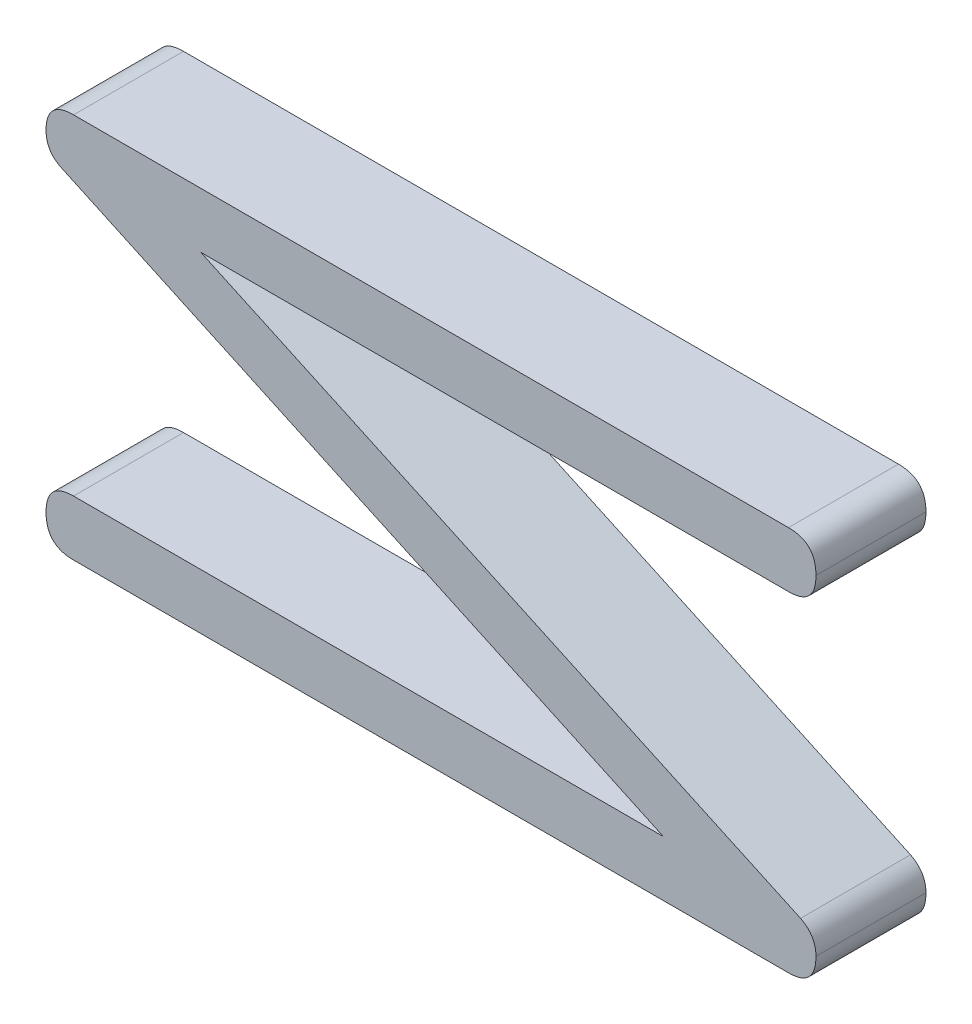
ISO-10303-21;
HEADER;
FILE_DESCRIPTION(('STEP AP214'),'2;1');
FILE_NAME('part.step','',(''),(''),'','','');
FILE_SCHEMA(('AUTOMOTIVE_DESIGN { 1 0 10303 214 1 1 1 1 }'));
ENDSEC;
DATA;
#1=APPLICATION_CONTEXT('core data for automotive mechanical design processes');
#2=APPLICATION_PROTOCOL_DEFINITION('international standard','automotive_design',2000,#1);
#3=PRODUCT_CONTEXT('',#1,'mechanical');
#4=PRODUCT('Part','Part','',(#3));
#5=PRODUCT_RELATED_PRODUCT_CATEGORY('part','',(#4));
#6=PRODUCT_DEFINITION_FORMATION('','',#4);
#7=PRODUCT_DEFINITION_CONTEXT('part definition',#1,'design');
#8=PRODUCT_DEFINITION('design','',#6,#7);
#9=PRODUCT_DEFINITION_SHAPE('','',#8);
#10=(LENGTH_UNIT() NAMED_UNIT(*) SI_UNIT(.MILLI.,.METRE.));
#11=(NAMED_UNIT(*) PLANE_ANGLE_UNIT() SI_UNIT($,.RADIAN.));
#12=(NAMED_UNIT(*) SI_UNIT($,.STERADIAN.) SOLID_ANGLE_UNIT());
#13=UNCERTAINTY_MEASURE_WITH_UNIT(LENGTH_MEASURE(1.E-05),#10,'distance_accuracy_value','');
#14=(GEOMETRIC_REPRESENTATION_CONTEXT(3) GLOBAL_UNCERTAINTY_ASSIGNED_CONTEXT((#13)) GLOBAL_UNIT_ASSIGNED_CONTEXT((#10,
#11,#12)) REPRESENTATION_CONTEXT('',''));
#15=CARTESIAN_POINT('',(0.,0.,0.));
#16=DIRECTION('',(0.,0.,1.));
#17=DIRECTION('',(1.,0.,0.));
#18=AXIS2_PLACEMENT_3D('',#15,#16,#17);
#19=CARTESIAN_POINT('',(0.,0.,-0.1));
#20=DIRECTION('',(0.,0.,1.));
#21=DIRECTION('',(1.,0.,0.));
#22=AXIS2_PLACEMENT_3D('',#19,#20,#21);
#23=PLANE('',#22);
#24=CARTESIAN_POINT('',(3.5250075,-20.49008,-0.1));
#25=CARTESIAN_POINT('',(3.52296452008364,-20.4900718505937,-0.1));
#26=CARTESIAN_POINT('',(3.5208903994327,-20.4899513868778,-0.1));
#27=CARTESIAN_POINT('',(3.51676154690741,-20.4893258347474,-0.1));
#28=CARTESIAN_POINT('',(3.51470814572294,-20.488812690891,-0.1));
#29=CARTESIAN_POINT('',(3.51078661994044,-20.4872236873782,-0.1));
#30=CARTESIAN_POINT('',(3.50891977957045,-20.4861442096614,-0.1));
#31=CARTESIAN_POINT('',(3.5056904265819,-20.4833732947515,-0.1));
#32=CARTESIAN_POINT('',(3.50432981317407,-20.4816795991802,-0.1));
#33=CARTESIAN_POINT('',(3.50199005832095,-20.4775521301757,-0.1));
#34=CARTESIAN_POINT('',(3.50116837346649,-20.4750376561436,-0.1));
#35=CARTESIAN_POINT('',(3.5001853549542,-20.4699423877113,-0.1));
#36=CARTESIAN_POINT('',(3.50000631658705,-20.4673653742619,-0.1));
#37=CARTESIAN_POINT('',(3.5,-20.46488,-0.1));
#38=B_SPLINE_CURVE_WITH_KNOTS('',3,(#24,#25,#26,#27,#28,#29,#30,#31,#32,#33,#34,#35,#36,#37),
.UNSPECIFIED.,.F.,.F.,(4,2,2,2,2,2,4),(0.,0.00617555295361522,0.0124813041899314,
0.018827839685844,0.0251979509500649,0.0330188630002425,0.0406225830086277),.UNSPECIFIED.);
#39=CARTESIAN_POINT('',(3.5250075,-20.49008,-0.1));
#40=VERTEX_POINT('',#39);
#41=CARTESIAN_POINT('',(3.5,-20.46488,-0.1));
#42=VERTEX_POINT('',#41);
#43=EDGE_CURVE('E267',#40,#42,#38,.T.);
#44=ORIENTED_EDGE('',*,*,#43,.T.);
#45=CARTESIAN_POINT('',(3.5,-20.46488,-0.1));
#46=CARTESIAN_POINT('',(3.50000893182355,-20.4627859598788,-0.1));
#47=CARTESIAN_POINT('',(3.5001321019316,-20.4606579623583,-0.1));
#48=CARTESIAN_POINT('',(3.50077736122484,-20.4564211796358,-0.1));
#49=CARTESIAN_POINT('',(3.50130815567586,-20.4543138438055,-0.1));
#50=CARTESIAN_POINT('',(3.50293808048682,-20.4503469956254,-0.1));
#51=CARTESIAN_POINT('',(3.50402636884528,-20.4484835777051,-0.1));
#52=CARTESIAN_POINT('',(3.50681364295623,-20.4452638408361,-0.1));
#53=CARTESIAN_POINT('',(3.50851494360153,-20.443909484388,-0.1));
#54=CARTESIAN_POINT('',(3.51264792830977,-20.4415948064364,-0.1));
#55=CARTESIAN_POINT('',(3.51515790533313,-20.4407889153056,-0.1));
#56=CARTESIAN_POINT('',(3.5201414548077,-20.4398544716161,-0.1));
#57=CARTESIAN_POINT('',(3.52260669071904,-20.439685103672,-0.1));
#58=CARTESIAN_POINT('',(3.52499,-20.43968,-0.1));
#59=B_SPLINE_CURVE_WITH_KNOTS('',3,(#45,#46,#47,#48,#49,#50,#51,#52,#53,#54,#55,#56,#57,#58),
.UNSPECIFIED.,.F.,.F.,(4,2,2,2,2,2,4),(0.,0.00633350416974893,0.0128061629194577,
0.0191574692673836,0.0255330155642557,0.0333252555174583,0.0406083684014851),.UNSPECIFIED.);
#60=CARTESIAN_POINT('',(3.52499,-20.43968,-0.1));
#61=VERTEX_POINT('',#60);
#62=EDGE_CURVE('E145',#42,#61,#59,.T.);
#63=ORIENTED_EDGE('',*,*,#62,.T.);
#64=DIRECTION('',(1.,0.,0.));
#65=VECTOR('',#64,1.);
#66=CARTESIAN_POINT('',(4.0614175,-20.43968,-0.1));
#67=LINE('',#66,#65);
#68=CARTESIAN_POINT('',(4.0614175,-20.43968,-0.1));
#69=VERTEX_POINT('',#68);
#70=EDGE_CURVE('E142',#69,#61,#67,.F.);
#71=ORIENTED_EDGE('',*,*,#70,.F.);
#72=DIRECTION('',(0.907820757142357,-0.419358406260656,0.));
#73=VECTOR('',#72,1.);
#74=CARTESIAN_POINT('',(3.51449,-20.1870325,-0.1));
#75=LINE('',#74,#73);
#76=CARTESIAN_POINT('',(3.51449,-20.1870325,-0.1));
#77=VERTEX_POINT('',#76);
#78=EDGE_CURVE('E149',#77,#69,#75,.T.);
#79=ORIENTED_EDGE('',*,*,#78,.F.);
#80=CARTESIAN_POINT('',(3.51449,-20.1870325,-0.1));
#81=CARTESIAN_POINT('',(3.51317660788709,-20.1864415152522,-0.1));
#82=CARTESIAN_POINT('',(3.51189568398104,-20.1857640365538,-0.1));
#83=CARTESIAN_POINT('',(3.50945267479109,-20.184209445395,-0.1));
#84=CARTESIAN_POINT('',(3.50829131387652,-20.1833312093119,-0.1));
#85=CARTESIAN_POINT('',(3.50546021943163,-20.1807084619182,-0.1));
#86=CARTESIAN_POINT('',(3.5039546931724,-20.1787730283499,-0.1));
#87=CARTESIAN_POINT('',(3.50170045192129,-20.1745267557376,-0.1));
#88=CARTESIAN_POINT('',(3.50095056821364,-20.1722165028545,-0.1));
#89=CARTESIAN_POINT('',(3.50014729378707,-20.1679203441977,-0.1));
#90=CARTESIAN_POINT('',(3.49999047038929,-20.1659538154576,-0.1));
#91=CARTESIAN_POINT('',(3.5,-20.16402,-0.1));
#92=B_SPLINE_CURVE_WITH_KNOTS('',3,(#80,#81,#82,#83,#84,#85,#86,#87,#88,#89,#90,#91),
.UNSPECIFIED.,.F.,.F.,(4,2,2,2,2,4),(0.,0.00432548880511277,0.00867580696156998,
0.0158710193284312,0.0230550860485164,0.0289058742713423),.UNSPECIFIED.);
#93=CARTESIAN_POINT('',(3.5,-20.16402,-0.1));
#94=VERTEX_POINT('',#93);
#95=EDGE_CURVE('E278',#77,#94,#92,.T.);
#96=ORIENTED_EDGE('',*,*,#95,.T.);
#97=CARTESIAN_POINT('',(3.5,-20.16402,-0.1));
#98=CARTESIAN_POINT('',(3.5000074677176,-20.1620457355184,-0.1));
#99=CARTESIAN_POINT('',(3.50012407901857,-20.1600428306186,-0.1));
#100=CARTESIAN_POINT('',(3.50072554080283,-20.1560562124187,-0.1));
#101=CARTESIAN_POINT('',(3.50121785646545,-20.1540737246085,-0.1));
#102=CARTESIAN_POINT('',(3.50275278149649,-20.1502439483329,-0.1));
#103=CARTESIAN_POINT('',(3.50380981073264,-20.1484017189147,-0.1));
#104=CARTESIAN_POINT('',(3.50652783424327,-20.1452121400093,-0.1));
#105=CARTESIAN_POINT('',(3.50819100701368,-20.1438666112378,-0.1));
#106=CARTESIAN_POINT('',(3.51225449404836,-20.1415412970796,-0.1));
#107=CARTESIAN_POINT('',(3.51473629318445,-20.1407191613942,-0.1));
#108=CARTESIAN_POINT('',(3.51984718867093,-20.1397113730119,-0.1));
#109=CARTESIAN_POINT('',(3.52247663930076,-20.1395273240125,-0.1));
#110=CARTESIAN_POINT('',(3.5250075,-20.13952,-0.1));
#111=B_SPLINE_CURVE_WITH_KNOTS('',3,(#97,#98,#99,#100,#101,#102,#103,#104,#105,#106,#107,#108,
#109,#110),.UNSPECIFIED.,.F.,.F.,(4,2,2,2,2,2,4),(0.,0.00596527696958312,0.0120522723231094,
0.0183026965668949,0.0245758101777502,0.0323066640740081,0.0400569338244089),.UNSPECIFIED.);
#112=CARTESIAN_POINT('',(3.5250075,-20.13952,-0.1));
#113=VERTEX_POINT('',#112);
#114=EDGE_CURVE('E158',#94,#113,#111,.T.);
#115=ORIENTED_EDGE('',*,*,#114,.T.);
#116=DIRECTION('',(1.,0.,0.));
#117=VECTOR('',#116,1.);
#118=CARTESIAN_POINT('',(4.1749925,-20.13952,-0.1));
#119=LINE('',#118,#117);
#120=CARTESIAN_POINT('',(4.1749925,-20.13952,-0.1));
#121=VERTEX_POINT('',#120);
#122=EDGE_CURVE('E155',#121,#113,#119,.F.);
#123=ORIENTED_EDGE('',*,*,#122,.F.);
#124=CARTESIAN_POINT('',(4.1749925,-20.13952,-0.1));
#125=CARTESIAN_POINT('',(4.17703547991636,-20.1395281494064,-0.1));
#126=CARTESIAN_POINT('',(4.1791096005673,-20.1396486131222,-0.1));
#127=CARTESIAN_POINT('',(4.1832384530926,-20.1402741652526,-0.1));
#128=CARTESIAN_POINT('',(4.18529185427707,-20.140787309109,-0.1));
#129=CARTESIAN_POINT('',(4.18921338005957,-20.1423763126218,-0.1));
#130=CARTESIAN_POINT('',(4.19108022042955,-20.1434557903386,-0.1));
#131=CARTESIAN_POINT('',(4.1943095734181,-20.1462267052485,-0.1));
#132=CARTESIAN_POINT('',(4.19567018682593,-20.1479204008198,-0.1));
#133=CARTESIAN_POINT('',(4.19800994167905,-20.1520478698243,-0.1));
#134=CARTESIAN_POINT('',(4.19883162653351,-20.1545623438564,-0.1));
#135=CARTESIAN_POINT('',(4.1998146450458,-20.1596576122887,-0.1));
#136=CARTESIAN_POINT('',(4.19999368341295,-20.1622346257381,-0.1));
#137=CARTESIAN_POINT('',(4.2,-20.16472,-0.1));
#138=B_SPLINE_CURVE_WITH_KNOTS('',3,(#124,#125,#126,#127,#128,#129,#130,#131,#132,#133,#134,
#135,#136,#137),.UNSPECIFIED.,.F.,.F.,(4,2,2,2,2,2,4),(0.,0.00617555295361936,
0.0124813041899398,0.0188278396858512,0.0251979509500656,0.0330188630002394,0.0406225830086281),.UNSPECIFIED.);
#139=CARTESIAN_POINT('',(4.2,-20.16472,-0.1));
#140=VERTEX_POINT('',#139);
#141=EDGE_CURVE('E287',#121,#140,#138,.T.);
#142=ORIENTED_EDGE('',*,*,#141,.T.);
#143=CARTESIAN_POINT('',(4.2,-20.16472,-0.1));
#144=CARTESIAN_POINT('',(4.1999909019491,-20.1668218121608,-0.1));
#145=CARTESIAN_POINT('',(4.19986734772854,-20.1689581728151,-0.1));
#146=CARTESIAN_POINT('',(4.19921879497746,-20.1732117648662,-0.1));
#147=CARTESIAN_POINT('',(4.19868495643573,-20.1753275219203,-0.1));
#148=CARTESIAN_POINT('',(4.19704865942118,-20.1792976064122,-0.1));
#149=CARTESIAN_POINT('',(4.19596028947454,-20.1811570254627,-0.1));
#150=CARTESIAN_POINT('',(4.19317420021518,-20.1843690212312,-0.1));
#151=CARTESIAN_POINT('',(4.19147415814831,-20.1857196252091,-0.1));
#152=CARTESIAN_POINT('',(4.18734703459122,-20.1880247878816,-0.1));
#153=CARTESIAN_POINT('',(4.18484230990065,-20.1888258249257,-0.1));
#154=CARTESIAN_POINT('',(4.17989147928511,-20.1897481820867,-0.1));
#155=CARTESIAN_POINT('',(4.17745460220649,-20.1899151452056,-0.1));
#156=CARTESIAN_POINT('',(4.1750975,-20.18992,-0.1));
#157=B_SPLINE_CURVE_WITH_KNOTS('',3,(#143,#144,#145,#146,#147,#148,#149,#150,#151,#152,#153,
#154,#155,#156),.UNSPECIFIED.,.F.,.F.,(4,2,2,2,2,2,4),(0.,0.00635783536498901,
0.0128566354820755,0.0191979975215553,0.0255636987977634,0.0333364174536253,0.0405376862319979),.UNSPECIFIED.);
#158=CARTESIAN_POINT('',(4.1750975,-20.18992,-0.1));
#159=VERTEX_POINT('',#158);
#160=EDGE_CURVE('E163',#140,#159,#157,.T.);
#161=ORIENTED_EDGE('',*,*,#160,.T.);
#162=DIRECTION('',(1.,0.,0.));
#163=VECTOR('',#162,1.);
#164=CARTESIAN_POINT('',(3.640665,-20.18992,-0.1));
#165=LINE('',#164,#163);
#166=CARTESIAN_POINT('',(3.640665,-20.18992,-0.1));
#167=VERTEX_POINT('',#166);
#168=EDGE_CURVE('E160',#167,#159,#165,.T.);
#169=ORIENTED_EDGE('',*,*,#168,.F.);
#170=DIRECTION('',(-0.907921004621454,0.419141323860067,0.));
#171=VECTOR('',#170,1.);
#172=CARTESIAN_POINT('',(4.185965,-20.4416575,-0.1));
#173=LINE('',#172,#171);
#174=CARTESIAN_POINT('',(4.185965,-20.4416575,-0.1));
#175=VERTEX_POINT('',#174);
#176=EDGE_CURVE('E167',#175,#167,#173,.T.);
#177=ORIENTED_EDGE('',*,*,#176,.F.);
#178=CARTESIAN_POINT('',(4.185965,-20.4416575,-0.1));
#179=CARTESIAN_POINT('',(4.18731203727069,-20.4423436849057,-0.1));
#180=CARTESIAN_POINT('',(4.18862081974825,-20.4431190392838,-0.1));
#181=CARTESIAN_POINT('',(4.1911032119283,-20.4448730263518,-0.1));
#182=CARTESIAN_POINT('',(4.19227603664418,-20.4458527561509,-0.1));
#183=CARTESIAN_POINT('',(4.19510370066546,-20.4487400800642,-0.1));
#184=CARTESIAN_POINT('',(4.19657816534535,-20.4508374566413,-0.1));
#185=CARTESIAN_POINT('',(4.19871785639162,-20.4553898753281,-0.1));
#186=CARTESIAN_POINT('',(4.19938428920636,-20.4578443780706,-0.1));
#187=CARTESIAN_POINT('',(4.19991690207689,-20.461754445559,-0.1));
#188=CARTESIAN_POINT('',(4.20000430958463,-20.4631840276869,-0.1));
#189=CARTESIAN_POINT('',(4.2,-20.4646,-0.1));
#190=B_SPLINE_CURVE_WITH_KNOTS('',3,(#178,#179,#180,#181,#182,#183,#184,#185,#186,#187,#188,
#189),.UNSPECIFIED.,.F.,.F.,(4,2,2,2,2,4),(0.,0.00454066265165424,0.0091063580087707,
0.0166317070213285,0.0241458062678159,0.0284174711604073),.UNSPECIFIED.);
#191=CARTESIAN_POINT('',(4.2,-20.4646,-0.1));
#192=VERTEX_POINT('',#191);
#193=EDGE_CURVE('E116',#175,#192,#190,.T.);
#194=ORIENTED_EDGE('',*,*,#193,.T.);
#195=CARTESIAN_POINT('',(4.2,-20.4646,-0.1));
#196=CARTESIAN_POINT('',(4.19999046333426,-20.4667405394319,-0.1));
#197=CARTESIAN_POINT('',(4.19986478440135,-20.4689172070653,-0.1));
#198=CARTESIAN_POINT('',(4.19920249182751,-20.4732513775683,-0.1));
#199=CARTESIAN_POINT('',(4.19865666740737,-20.4754073390828,-0.1));
#200=CARTESIAN_POINT('',(4.19698951613697,-20.4794278413444,-0.1));
#201=CARTESIAN_POINT('',(4.1958889207296,-20.4812999224628,-0.1));
#202=CARTESIAN_POINT('',(4.19307431168142,-20.484532130242,-0.1));
#203=CARTESIAN_POINT('',(4.19135793471003,-20.4858902424786,-0.1));
#204=CARTESIAN_POINT('',(4.18719663354415,-20.4882021559139,-0.1));
#205=CARTESIAN_POINT('',(4.18467447150821,-20.4890025020549,-0.1));
#206=CARTESIAN_POINT('',(4.17973286315946,-20.4899114662173,-0.1));
#207=CARTESIAN_POINT('',(4.17732440963894,-20.4900755557157,-0.1));
#208=CARTESIAN_POINT('',(4.1749925,-20.49008,-0.1));
#209=B_SPLINE_CURVE_WITH_KNOTS('',3,(#195,#196,#197,#198,#199,#200,#201,#202,#203,#204,#205,
#206,#207,#208),.UNSPECIFIED.,.F.,.F.,(4,2,2,2,2,2,4),(0.,0.0064766563185409,0.0130994908391594,
0.0194913871630938,0.0259080823184698,0.0337285852183506,0.0408495411647651),.UNSPECIFIED.);
#210=CARTESIAN_POINT('',(4.1749925,-20.49008,-0.1));
#211=VERTEX_POINT('',#210);
#212=EDGE_CURVE('E24',#192,#211,#209,.T.);
#213=ORIENTED_EDGE('',*,*,#212,.T.);
#214=DIRECTION('',(1.,0.,0.));
#215=VECTOR('',#214,1.);
#216=CARTESIAN_POINT('',(3.5250075,-20.49008,-0.1));
#217=LINE('',#216,#215);
#218=EDGE_CURVE('E119',#40,#211,#217,.T.);
#219=ORIENTED_EDGE('',*,*,#218,.F.);
#220=EDGE_LOOP('',(#44,#63,#71,#79,#96,#115,#123,#142,#161,#169,#177,#194,#213,#219));
#221=FACE_BOUND('',#220,.T.);
#222=ADVANCED_FACE('F17',(#221),#23,.F.);
#223=CARTESIAN_POINT('',(3.5250075,-20.49008,-0.1));
#224=DIRECTION('',(0.,-1.,0.));
#225=DIRECTION('',(0.,0.,-1.));
#226=AXIS2_PLACEMENT_3D('',#223,#224,#225);
#227=PLANE('',#226);
#228=ORIENTED_EDGE('',*,*,#218,.T.);
#229=DIRECTION('',(0.,0.,1.));
#230=VECTOR('',#229,1.);
#231=CARTESIAN_POINT('',(4.1749925,-20.49008,-0.05));
#232=LINE('',#231,#230);
#233=CARTESIAN_POINT('',(4.1749925,-20.49008,0.));
#234=VERTEX_POINT('',#233);
#235=EDGE_CURVE('E124',#211,#234,#232,.T.);
#236=ORIENTED_EDGE('',*,*,#235,.T.);
#237=DIRECTION('',(1.,0.,0.));
#238=VECTOR('',#237,1.);
#239=CARTESIAN_POINT('',(0.,-20.49008,0.));
#240=LINE('',#239,#238);
#241=CARTESIAN_POINT('',(3.5250075,-20.49008,0.));
#242=VERTEX_POINT('',#241);
#243=EDGE_CURVE('E380',#242,#234,#240,.T.);
#244=ORIENTED_EDGE('',*,*,#243,.F.);
#245=DIRECTION('',(0.,0.,-1.));
#246=VECTOR('',#245,1.);
#247=CARTESIAN_POINT('',(3.5250075,-20.49008,-0.05));
#248=LINE('',#247,#246);
#249=EDGE_CURVE('E130',#242,#40,#248,.T.);
#250=ORIENTED_EDGE('',*,*,#249,.T.);
#251=EDGE_LOOP('',(#228,#236,#244,#250));
#252=FACE_BOUND('',#251,.T.);
#253=ADVANCED_FACE('F126',(#252),#227,.T.);
#254=CARTESIAN_POINT('',(4.1749925,-20.49008,-0.1));
#255=CARTESIAN_POINT('',(4.2,-20.49008,-0.1));
#256=CARTESIAN_POINT('',(4.2,-20.4646,-0.1));
#257=CARTESIAN_POINT('',(4.1749925,-20.49008,0.));
#258=CARTESIAN_POINT('',(4.2,-20.49008,0.));
#259=CARTESIAN_POINT('',(4.2,-20.4646,0.));
#260=B_SPLINE_SURFACE_WITH_KNOTS('',1,2,((#254,#255,#256),(#257,#258,#259)),.UNSPECIFIED.,.F.,
.F.,.F.,(2,2),(3,3),(0.,1.),(0.,1.),.UNSPECIFIED.);
#261=DIRECTION('',(0.,0.,1.));
#262=VECTOR('',#261,1.);
#263=CARTESIAN_POINT('',(4.2,-20.4646,-0.05));
#264=LINE('',#263,#262);
#265=CARTESIAN_POINT('',(4.2,-20.4646,0.));
#266=VERTEX_POINT('',#265);
#267=EDGE_CURVE('E138',#192,#266,#264,.T.);
#268=CARTESIAN_POINT('',(4.1749925,-20.49008,0.));
#269=CARTESIAN_POINT('',(4.17701151499175,-20.4900723065724,0.));
#270=CARTESIAN_POINT('',(4.17906002173778,-20.4899530788115,0.));
#271=CARTESIAN_POINT('',(4.18313747106127,-20.4893375513138,0.));
#272=CARTESIAN_POINT('',(4.18516515198397,-20.4888335727697,0.));
#273=CARTESIAN_POINT('',(4.18907600721271,-20.4872637802937,0.));
#274=CARTESIAN_POINT('',(4.19095454431362,-20.4861847701539,0.));
#275=CARTESIAN_POINT('',(4.19420659474089,-20.4834108898415,0.));
#276=CARTESIAN_POINT('',(4.19557824385566,-20.4817137910214,0.));
#277=CARTESIAN_POINT('',(4.19794706220901,-20.4775689027058,0.));
#278=CARTESIAN_POINT('',(4.19878380176105,-20.4750382876607,0.));
#279=CARTESIAN_POINT('',(4.19980606163213,-20.4698385047735,0.));
#280=CARTESIAN_POINT('',(4.1999926943804,-20.4671695815496,0.));
#281=CARTESIAN_POINT('',(4.2,-20.4646,0.));
#282=B_SPLINE_CURVE_WITH_KNOTS('',3,(#268,#269,#270,#271,#272,#273,#274,#275,#276,#277,#278,
#279,#280,#281),.UNSPECIFIED.,.F.,.F.,(4,2,2,2,2,2,4),(0.,0.00610084746813873,
0.0123267448899605,0.0187020922226042,0.0251006585430123,0.0329819365329532,0.0408497218438369),.UNSPECIFIED.);
#283=EDGE_CURVE('E135',#234,#266,#282,.T.);
#284=ORIENTED_EDGE('',*,*,#235,.F.);
#285=ORIENTED_EDGE('',*,*,#212,.F.);
#286=ORIENTED_EDGE('',*,*,#267,.T.);
#287=ORIENTED_EDGE('',*,*,#283,.F.);
#288=EDGE_LOOP('',(#284,#285,#286,#287));
#289=FACE_BOUND('',#288,.T.);
#290=ADVANCED_FACE('F133',(#289),#260,.F.);
#291=CARTESIAN_POINT('',(4.2,-20.4646,-0.1));
#292=CARTESIAN_POINT('',(4.2,-20.4487975,-0.1));
#293=CARTESIAN_POINT('',(4.185965,-20.4416575,-0.1));
#294=CARTESIAN_POINT('',(4.2,-20.4646,0.));
#295=CARTESIAN_POINT('',(4.2,-20.4487975,0.));
#296=CARTESIAN_POINT('',(4.185965,-20.4416575,0.));
#297=B_SPLINE_SURFACE_WITH_KNOTS('',1,2,((#291,#292,#293),(#294,#295,#296)),.UNSPECIFIED.,.F.,
.F.,.F.,(2,2),(3,3),(0.,1.),(0.,1.),.UNSPECIFIED.);
#298=DIRECTION('',(0.,0.,1.));
#299=VECTOR('',#298,1.);
#300=CARTESIAN_POINT('',(4.185965,-20.4416575,-0.1));
#301=LINE('',#300,#299);
#302=CARTESIAN_POINT('',(4.185965,-20.4416575,0.));
#303=VERTEX_POINT('',#302);
#304=EDGE_CURVE('E170',#303,#175,#301,.F.);
#305=CARTESIAN_POINT('',(4.2,-20.4646,0.));
#306=CARTESIAN_POINT('',(4.1999991069653,-20.4630763957042,0.));
#307=CARTESIAN_POINT('',(4.19990105341469,-20.4615462636576,0.));
#308=CARTESIAN_POINT('',(4.199460395789,-20.4585140988015,0.));
#309=CARTESIAN_POINT('',(4.19911637838131,-20.4570122801095,0.));
#310=CARTESIAN_POINT('',(4.19781962060164,-20.4531698297235,0.));
#311=CARTESIAN_POINT('',(4.19661891772639,-20.4509029946544,0.));
#312=CARTESIAN_POINT('',(4.19352884828714,-20.4469295927163,0.));
#313=CARTESIAN_POINT('',(4.19164041378093,-20.4452222734776,0.));
#314=CARTESIAN_POINT('',(4.18841510175441,-20.4429944305895,0.));
#315=CARTESIAN_POINT('',(4.18720450833347,-20.4422832221327,0.));
#316=CARTESIAN_POINT('',(4.185965,-20.4416575,0.));
#317=B_SPLINE_CURVE_WITH_KNOTS('',3,(#305,#306,#307,#308,#309,#310,#311,#312,#313,#314,#315,
#316),.UNSPECIFIED.,.F.,.F.,(4,2,2,2,2,4),(0.,0.00457654629606753,0.00917960343418862,
0.0167093542780306,0.0242289380696415,0.0284172090697264),.UNSPECIFIED.);
#318=EDGE_CURVE('E220',#266,#303,#317,.T.);
#319=ORIENTED_EDGE('',*,*,#267,.F.);
#320=ORIENTED_EDGE('',*,*,#193,.F.);
#321=ORIENTED_EDGE('',*,*,#304,.F.);
#322=ORIENTED_EDGE('',*,*,#318,.F.);
#323=EDGE_LOOP('',(#319,#320,#321,#322));
#324=FACE_BOUND('',#323,.T.);
#325=ADVANCED_FACE('F231',(#324),#297,.F.);
#326=CARTESIAN_POINT('',(4.185965,-20.4416575,-0.1));
#327=DIRECTION('',(0.419141323860067,0.907921004621454,0.));
#328=DIRECTION('',(-0.907921004621454,0.419141323860067,0.));
#329=AXIS2_PLACEMENT_3D('',#326,#327,#328);
#330=PLANE('',#329);
#331=ORIENTED_EDGE('',*,*,#176,.T.);
#332=DIRECTION('',(0.,0.,-1.));
#333=VECTOR('',#332,1.);
#334=CARTESIAN_POINT('',(3.640665,-20.18992,-0.1));
#335=LINE('',#334,#333);
#336=CARTESIAN_POINT('',(3.640665,-20.18992,0.));
#337=VERTEX_POINT('',#336);
#338=EDGE_CURVE('E164',#337,#167,#335,.T.);
#339=ORIENTED_EDGE('',*,*,#338,.F.);
#340=DIRECTION('',(-0.907921004621454,0.419141323860067,0.));
#341=VECTOR('',#340,1.);
#342=CARTESIAN_POINT('',(4.185965,-20.4416575,0.));
#343=LINE('',#342,#341);
#344=EDGE_CURVE('E226',#303,#337,#343,.T.);
#345=ORIENTED_EDGE('',*,*,#344,.F.);
#346=ORIENTED_EDGE('',*,*,#304,.T.);
#347=EDGE_LOOP('',(#331,#339,#345,#346));
#348=FACE_BOUND('',#347,.T.);
#349=ADVANCED_FACE('F236',(#348),#330,.T.);
#350=CARTESIAN_POINT('',(3.640665,-20.18992,-0.1));
#351=DIRECTION('',(0.,-1.,0.));
#352=DIRECTION('',(0.,0.,-1.));
#353=AXIS2_PLACEMENT_3D('',#350,#351,#352);
#354=PLANE('',#353);
#355=ORIENTED_EDGE('',*,*,#168,.T.);
#356=DIRECTION('',(0.,0.,1.));
#357=VECTOR('',#356,1.);
#358=CARTESIAN_POINT('',(4.1750975,-20.18992,-0.05));
#359=LINE('',#358,#357);
#360=CARTESIAN_POINT('',(4.1750975,-20.18992,0.));
#361=VERTEX_POINT('',#360);
#362=EDGE_CURVE('E292',#159,#361,#359,.T.);
#363=ORIENTED_EDGE('',*,*,#362,.T.);
#364=DIRECTION('',(1.,0.,0.));
#365=VECTOR('',#364,1.);
#366=CARTESIAN_POINT('',(0.,-20.18992,0.));
#367=LINE('',#366,#365);
#368=EDGE_CURVE('E386',#337,#361,#367,.T.);
#369=ORIENTED_EDGE('',*,*,#368,.F.);
#370=ORIENTED_EDGE('',*,*,#338,.T.);
#371=EDGE_LOOP('',(#355,#363,#369,#370));
#372=FACE_BOUND('',#371,.T.);
#373=ADVANCED_FACE('F418',(#372),#354,.T.);
#374=CARTESIAN_POINT('',(4.1750975,-20.18992,-0.1));
#375=CARTESIAN_POINT('',(4.2,-20.18992,-0.1));
#376=CARTESIAN_POINT('',(4.2,-20.16472,-0.1));
#377=CARTESIAN_POINT('',(4.1750975,-20.18992,0.));
#378=CARTESIAN_POINT('',(4.2,-20.18992,0.));
#379=CARTESIAN_POINT('',(4.2,-20.16472,0.));
#380=B_SPLINE_SURFACE_WITH_KNOTS('',1,2,((#374,#375,#376),(#377,#378,#379)),.UNSPECIFIED.,.F.,
.F.,.F.,(2,2),(3,3),(0.,1.),(0.,1.),.UNSPECIFIED.);
#381=DIRECTION('',(0.,0.,1.));
#382=VECTOR('',#381,1.);
#383=CARTESIAN_POINT('',(4.2,-20.16472,-0.05));
#384=LINE('',#383,#382);
#385=CARTESIAN_POINT('',(4.2,-20.16472,0.));
#386=VERTEX_POINT('',#385);
#387=EDGE_CURVE('E291',#140,#386,#384,.T.);
#388=CARTESIAN_POINT('',(4.1750975,-20.18992,0.));
#389=CARTESIAN_POINT('',(4.17712279571802,-20.189912061044,0.));
#390=CARTESIAN_POINT('',(4.17917846568021,-20.1897925700579,0.));
#391=CARTESIAN_POINT('',(4.18327042743507,-20.1891734608418,0.));
#392=CARTESIAN_POINT('',(4.18530542077264,-20.1886659661407,0.));
#393=CARTESIAN_POINT('',(4.18920646570121,-20.1870909569996,0.));
#394=CARTESIAN_POINT('',(4.19106994820774,-20.1860161768611,0.));
#395=CARTESIAN_POINT('',(4.19429443272661,-20.1832557297779,0.));
#396=CARTESIAN_POINT('',(4.1956535566115,-20.1815678249291,0.));
#397=CARTESIAN_POINT('',(4.1979945463625,-20.1774510284904,0.));
#398=CARTESIAN_POINT('',(4.19881849633399,-20.1749409744781,0.));
#399=CARTESIAN_POINT('',(4.19981218436634,-20.1698275960162,0.));
#400=CARTESIAN_POINT('',(4.1999933476224,-20.1672267391435,0.));
#401=CARTESIAN_POINT('',(4.2,-20.16472,0.));
#402=B_SPLINE_CURVE_WITH_KNOTS('',3,(#388,#389,#390,#391,#392,#393,#394,#395,#396,#397,#398,
#399,#400,#401),.UNSPECIFIED.,.F.,.F.,(4,2,2,2,2,2,4),(0.,0.00612121982034474,
0.0123701121634089,0.0187010539466916,0.0250553397488909,0.0328663454030752,0.0405377990669611),.UNSPECIFIED.);
#403=EDGE_CURVE('E214',#361,#386,#402,.T.);
#404=ORIENTED_EDGE('',*,*,#362,.F.);
#405=ORIENTED_EDGE('',*,*,#160,.F.);
#406=ORIENTED_EDGE('',*,*,#387,.T.);
#407=ORIENTED_EDGE('',*,*,#403,.F.);
#408=EDGE_LOOP('',(#404,#405,#406,#407));
#409=FACE_BOUND('',#408,.T.);
#410=ADVANCED_FACE('F241',(#409),#380,.F.);
#411=CARTESIAN_POINT('',(4.2,-20.16472,-0.1));
#412=CARTESIAN_POINT('',(4.2,-20.13952,-0.1));
#413=CARTESIAN_POINT('',(4.1749925,-20.13952,-0.1));
#414=CARTESIAN_POINT('',(4.2,-20.16472,0.));
#415=CARTESIAN_POINT('',(4.2,-20.13952,0.));
#416=CARTESIAN_POINT('',(4.1749925,-20.13952,0.));
#417=B_SPLINE_SURFACE_WITH_KNOTS('',1,2,((#411,#412,#413),(#414,#415,#416)),.UNSPECIFIED.,.F.,
.F.,.F.,(2,2),(3,3),(0.,1.),(0.,1.),.UNSPECIFIED.);
#418=DIRECTION('',(0.,0.,1.));
#419=VECTOR('',#418,1.);
#420=CARTESIAN_POINT('',(4.1749925,-20.13952,-0.1));
#421=LINE('',#420,#419);
#422=CARTESIAN_POINT('',(4.1749925,-20.13952,0.));
#423=VERTEX_POINT('',#422);
#424=EDGE_CURVE('E159',#423,#121,#421,.F.);
#425=CARTESIAN_POINT('',(4.2,-20.16472,0.));
#426=CARTESIAN_POINT('',(4.19999110096266,-20.1626275091769,0.));
#427=CARTESIAN_POINT('',(4.19986800774301,-20.1605011777151,0.));
#428=CARTESIAN_POINT('',(4.19922340420426,-20.1562677431589,0.));
#429=CARTESIAN_POINT('',(4.19869321523881,-20.154162084508,0.));
#430=CARTESIAN_POINT('',(4.19706455794296,-20.150195885421,0.));
#431=CARTESIAN_POINT('',(4.19597628705331,-20.1483316739845,0.));
#432=CARTESIAN_POINT('',(4.19318878061457,-20.1451104007398,0.));
#433=CARTESIAN_POINT('',(4.19148723177183,-20.1437552993711,0.));
#434=CARTESIAN_POINT('',(4.18735308226687,-20.141438726252,0.));
#435=CARTESIAN_POINT('',(4.18484205841295,-20.1406318670435,0.));
#436=CARTESIAN_POINT('',(4.17985196635005,-20.1396950029192,0.));
#437=CARTESIAN_POINT('',(4.17738105248016,-20.139525154461,0.));
#438=CARTESIAN_POINT('',(4.1749925,-20.13952,0.));
#439=B_SPLINE_CURVE_WITH_KNOTS('',3,(#425,#426,#427,#428,#429,#430,#431,#432,#433,#434,#435,
#436,#437,#438),.UNSPECIFIED.,.F.,.F.,(4,2,2,2,2,2,4),(0.,0.00632865589769371,
0.0127961082036661,0.0191493863521922,0.025526884360981,0.0333230170829283,0.0406225102328519),.UNSPECIFIED.);
#440=EDGE_CURVE('E208',#386,#423,#439,.T.);
#441=ORIENTED_EDGE('',*,*,#387,.F.);
#442=ORIENTED_EDGE('',*,*,#141,.F.);
#443=ORIENTED_EDGE('',*,*,#424,.F.);
#444=ORIENTED_EDGE('',*,*,#440,.F.);
#445=EDGE_LOOP('',(#441,#442,#443,#444));
#446=FACE_BOUND('',#445,.T.);
#447=ADVANCED_FACE('F293',(#446),#417,.F.);
#448=CARTESIAN_POINT('',(4.1749925,-20.13952,-0.1));
#449=DIRECTION('',(0.,1.,0.));
#450=DIRECTION('',(0.,0.,1.));
#451=AXIS2_PLACEMENT_3D('',#448,#449,#450);
#452=PLANE('',#451);
#453=ORIENTED_EDGE('',*,*,#122,.T.);
#454=DIRECTION('',(0.,0.,1.));
#455=VECTOR('',#454,1.);
#456=CARTESIAN_POINT('',(3.5250075,-20.13952,-0.05));
#457=LINE('',#456,#455);
#458=CARTESIAN_POINT('',(3.5250075,-20.13952,0.));
#459=VERTEX_POINT('',#458);
#460=EDGE_CURVE('E366',#113,#459,#457,.T.);
#461=ORIENTED_EDGE('',*,*,#460,.T.);
#462=DIRECTION('',(1.,0.,0.));
#463=VECTOR('',#462,1.);
#464=CARTESIAN_POINT('',(0.,-20.13952,0.));
#465=LINE('',#464,#463);
#466=EDGE_CURVE('E391',#423,#459,#465,.F.);
#467=ORIENTED_EDGE('',*,*,#466,.F.);
#468=ORIENTED_EDGE('',*,*,#424,.T.);
#469=EDGE_LOOP('',(#453,#461,#467,#468));
#470=FACE_BOUND('',#469,.T.);
#471=ADVANCED_FACE('F298',(#470),#452,.T.);
#472=CARTESIAN_POINT('',(3.5250075,-20.13952,-0.1));
#473=CARTESIAN_POINT('',(3.5,-20.13952,-0.1));
#474=CARTESIAN_POINT('',(3.5,-20.16402,-0.1));
#475=CARTESIAN_POINT('',(3.5250075,-20.13952,0.));
#476=CARTESIAN_POINT('',(3.5,-20.13952,0.));
#477=CARTESIAN_POINT('',(3.5,-20.16402,0.));
#478=B_SPLINE_SURFACE_WITH_KNOTS('',1,2,((#472,#473,#474),(#475,#476,#477)),.UNSPECIFIED.,.F.,
.F.,.F.,(2,2),(3,3),(0.,1.),(0.,1.),.UNSPECIFIED.);
#479=DIRECTION('',(0.,0.,1.));
#480=VECTOR('',#479,1.);
#481=CARTESIAN_POINT('',(3.5,-20.16402,-0.05));
#482=LINE('',#481,#480);
#483=CARTESIAN_POINT('',(3.5,-20.16402,0.));
#484=VERTEX_POINT('',#483);
#485=EDGE_CURVE('E364',#94,#484,#482,.T.);
#486=CARTESIAN_POINT('',(3.5250075,-20.13952,0.));
#487=CARTESIAN_POINT('',(3.52290270987083,-20.1395294483265,0.));
#488=CARTESIAN_POINT('',(3.52076214885965,-20.1396529878734,0.));
#489=CARTESIAN_POINT('',(3.51649978798225,-20.1403046794648,0.));
#490=CARTESIAN_POINT('',(3.5143795141504,-20.1408419427306,0.));
#491=CARTESIAN_POINT('',(3.51043197029052,-20.142481445228,0.));
#492=CARTESIAN_POINT('',(3.50859667588643,-20.1435616591637,0.));
#493=CARTESIAN_POINT('',(3.50542841217494,-20.1463234294065,0.));
#494=CARTESIAN_POINT('',(3.50409742490301,-20.1480073088408,0.));
#495=CARTESIAN_POINT('',(3.50183323195281,-20.152088428429,0.));
#496=CARTESIAN_POINT('',(3.50105018631107,-20.1545611524326,0.));
#497=CARTESIAN_POINT('',(3.50016408788517,-20.1593947456342,0.));
#498=CARTESIAN_POINT('',(3.50000424844527,-20.1617444212981,0.));
#499=CARTESIAN_POINT('',(3.5,-20.16402,0.));
#500=B_SPLINE_CURVE_WITH_KNOTS('',3,(#486,#487,#488,#489,#490,#491,#492,#493,#494,#495,#496,
#497,#498,#499),.UNSPECIFIED.,.F.,.F.,(4,2,2,2,2,2,4),(0.,0.00636892627281603,
0.0128822703642222,0.0191504691565485,0.0254430538991357,0.0331086429415725,0.0400567392329556),.UNSPECIFIED.);
#501=EDGE_CURVE('E201',#459,#484,#500,.T.);
#502=ORIENTED_EDGE('',*,*,#460,.F.);
#503=ORIENTED_EDGE('',*,*,#114,.F.);
#504=ORIENTED_EDGE('',*,*,#485,.T.);
#505=ORIENTED_EDGE('',*,*,#501,.F.);
#506=EDGE_LOOP('',(#502,#503,#504,#505));
#507=FACE_BOUND('',#506,.T.);
#508=ADVANCED_FACE('F300',(#507),#478,.F.);
#509=CARTESIAN_POINT('',(3.5,-20.16402,-0.1));
#510=CARTESIAN_POINT('',(3.5,-20.1805225,-0.1));
#511=CARTESIAN_POINT('',(3.51449,-20.1870325,-0.1));
#512=CARTESIAN_POINT('',(3.5,-20.16402,0.));
#513=CARTESIAN_POINT('',(3.5,-20.1805225,0.));
#514=CARTESIAN_POINT('',(3.51449,-20.1870325,0.));
#515=B_SPLINE_SURFACE_WITH_KNOTS('',1,2,((#509,#510,#511),(#512,#513,#514)),.UNSPECIFIED.,.F.,
.F.,.F.,(2,2),(3,3),(0.,1.),(0.,1.),.UNSPECIFIED.);
#516=DIRECTION('',(0.,0.,1.));
#517=VECTOR('',#516,1.);
#518=CARTESIAN_POINT('',(3.51449,-20.1870325,-0.1));
#519=LINE('',#518,#517);
#520=CARTESIAN_POINT('',(3.51449,-20.1870325,0.));
#521=VERTEX_POINT('',#520);
#522=EDGE_CURVE('E152',#521,#77,#519,.F.);
#523=CARTESIAN_POINT('',(3.5,-20.16402,0.));
#524=CARTESIAN_POINT('',(3.49999992240142,-20.1657951018157,0.));
#525=CARTESIAN_POINT('',(3.50012685674306,-20.1675864450601,0.));
#526=CARTESIAN_POINT('',(3.50071465152599,-20.1711216432824,0.));
#527=CARTESIAN_POINT('',(3.5011775259853,-20.1728651457192,0.));
#528=CARTESIAN_POINT('',(3.50274923849662,-20.176773525126,0.));
#529=CARTESIAN_POINT('',(3.50402526323057,-20.1788776283723,0.));
#530=CARTESIAN_POINT('',(3.5072057395288,-20.1825104995821,0.));
#531=CARTESIAN_POINT('',(3.50910921316659,-20.1840401549791,0.));
#532=CARTESIAN_POINT('',(3.5122419434531,-20.1859481237925,0.));
#533=CARTESIAN_POINT('',(3.51335554472576,-20.1865264505719,0.));
#534=CARTESIAN_POINT('',(3.51449,-20.1870325,0.));
#535=B_SPLINE_CURVE_WITH_KNOTS('',3,(#523,#524,#525,#526,#527,#528,#529,#530,#531,#532,#533,
#534),.UNSPECIFIED.,.F.,.F.,(4,2,2,2,2,4),(0.,0.00534523337421056,0.0107227798608189,
0.0179461004926646,0.025158215848064,0.0289040222259598),.UNSPECIFIED.);
#536=EDGE_CURVE('E194',#484,#521,#535,.T.);
#537=ORIENTED_EDGE('',*,*,#485,.F.);
#538=ORIENTED_EDGE('',*,*,#95,.F.);
#539=ORIENTED_EDGE('',*,*,#522,.F.);
#540=ORIENTED_EDGE('',*,*,#536,.F.);
#541=EDGE_LOOP('',(#537,#538,#539,#540));
#542=FACE_BOUND('',#541,.T.);
#543=ADVANCED_FACE('F311',(#542),#515,.F.);
#544=CARTESIAN_POINT('',(3.51449,-20.1870325,-0.1));
#545=DIRECTION('',(-0.419358406260656,-0.907820757142357,0.));
#546=DIRECTION('',(0.907820757142357,-0.419358406260656,0.));
#547=AXIS2_PLACEMENT_3D('',#544,#545,#546);
#548=PLANE('',#547);
#549=ORIENTED_EDGE('',*,*,#78,.T.);
#550=DIRECTION('',(0.,0.,1.));
#551=VECTOR('',#550,1.);
#552=CARTESIAN_POINT('',(4.0614175,-20.43968,-0.1));
#553=LINE('',#552,#551);
#554=CARTESIAN_POINT('',(4.0614175,-20.43968,0.));
#555=VERTEX_POINT('',#554);
#556=EDGE_CURVE('E146',#555,#69,#553,.F.);
#557=ORIENTED_EDGE('',*,*,#556,.F.);
#558=DIRECTION('',(0.907820757142359,-0.419358406260651,0.));
#559=VECTOR('',#558,1.);
#560=CARTESIAN_POINT('',(3.51449,-20.1870325,0.));
#561=LINE('',#560,#559);
#562=EDGE_CURVE('E396',#521,#555,#561,.T.);
#563=ORIENTED_EDGE('',*,*,#562,.F.);
#564=ORIENTED_EDGE('',*,*,#522,.T.);
#565=EDGE_LOOP('',(#549,#557,#563,#564));
#566=FACE_BOUND('',#565,.T.);
#567=ADVANCED_FACE('F323',(#566),#548,.T.);
#568=CARTESIAN_POINT('',(4.0614175,-20.43968,-0.1));
#569=DIRECTION('',(0.,1.,0.));
#570=DIRECTION('',(0.,0.,1.));
#571=AXIS2_PLACEMENT_3D('',#568,#569,#570);
#572=PLANE('',#571);
#573=ORIENTED_EDGE('',*,*,#70,.T.);
#574=DIRECTION('',(0.,0.,1.));
#575=VECTOR('',#574,1.);
#576=CARTESIAN_POINT('',(3.52499,-20.43968,-0.05));
#577=LINE('',#576,#575);
#578=CARTESIAN_POINT('',(3.52499,-20.43968,0.));
#579=VERTEX_POINT('',#578);
#580=EDGE_CURVE('E350',#61,#579,#577,.T.);
#581=ORIENTED_EDGE('',*,*,#580,.T.);
#582=DIRECTION('',(1.,0.,0.));
#583=VECTOR('',#582,1.);
#584=CARTESIAN_POINT('',(0.,-20.43968,0.));
#585=LINE('',#584,#583);
#586=EDGE_CURVE('E399',#555,#579,#585,.F.);
#587=ORIENTED_EDGE('',*,*,#586,.F.);
#588=ORIENTED_EDGE('',*,*,#556,.T.);
#589=EDGE_LOOP('',(#573,#581,#587,#588));
#590=FACE_BOUND('',#589,.T.);
#591=ADVANCED_FACE('F186',(#590),#572,.T.);
#592=CARTESIAN_POINT('',(3.52499,-20.43968,-0.1));
#593=CARTESIAN_POINT('',(3.5,-20.43968,-0.1));
#594=CARTESIAN_POINT('',(3.5,-20.46488,-0.1));
#595=CARTESIAN_POINT('',(3.52499,-20.43968,0.));
#596=CARTESIAN_POINT('',(3.5,-20.43968,0.));
#597=CARTESIAN_POINT('',(3.5,-20.46488,0.));
#598=B_SPLINE_SURFACE_WITH_KNOTS('',1,2,((#592,#593,#594),(#595,#596,#597)),.UNSPECIFIED.,.F.,
.F.,.F.,(2,2),(3,3),(0.,1.),(0.,1.),.UNSPECIFIED.);
#599=DIRECTION('',(0.,0.,1.));
#600=VECTOR('',#599,1.);
#601=CARTESIAN_POINT('',(3.5,-20.46488,-0.05));
#602=LINE('',#601,#600);
#603=CARTESIAN_POINT('',(3.5,-20.46488,0.));
#604=VERTEX_POINT('',#603);
#605=EDGE_CURVE('E44',#42,#604,#602,.T.);
#606=CARTESIAN_POINT('',(3.52499,-20.43968,0.));
#607=CARTESIAN_POINT('',(3.5229499717373,-20.439688113989,0.));
#608=CARTESIAN_POINT('',(3.52087893158621,-20.4398084155998,0.));
#609=CARTESIAN_POINT('',(3.51675623869121,-20.4404328914952,0.));
#610=CARTESIAN_POINT('',(3.51470591121584,-20.4409450911469,0.));
#611=CARTESIAN_POINT('',(3.51078779745363,-20.4425317568275,0.));
#612=CARTESIAN_POINT('',(3.50892151155204,-20.4436104525991,0.));
#613=CARTESIAN_POINT('',(3.50569296023641,-20.4463796267908,0.));
#614=CARTESIAN_POINT('',(3.50433259052938,-20.4480723601977,0.));
#615=CARTESIAN_POINT('',(3.50199262333998,-20.4521980568263,0.));
#616=CARTESIAN_POINT('',(3.50117055872279,-20.4547117974133,0.));
#617=CARTESIAN_POINT('',(3.50018576466059,-20.459810084991,0.));
#618=CARTESIAN_POINT('',(3.50000637159716,-20.4623910666417,0.));
#619=CARTESIAN_POINT('',(3.5,-20.46488,0.));
#620=B_SPLINE_CURVE_WITH_KNOTS('',3,(#606,#607,#608,#609,#610,#611,#612,#613,#614,#615,#616,
#617,#618,#619),.UNSPECIFIED.,.F.,.F.,(4,2,2,2,2,2,4),(0.,0.00616648259272014,
0.0124627395857254,0.0188066903326148,0.0251741784016629,0.0329934495468951,0.0406084478282437),.UNSPECIFIED.);
#621=EDGE_CURVE('E35',#579,#604,#620,.T.);
#622=ORIENTED_EDGE('',*,*,#580,.F.);
#623=ORIENTED_EDGE('',*,*,#62,.F.);
#624=ORIENTED_EDGE('',*,*,#605,.T.);
#625=ORIENTED_EDGE('',*,*,#621,.F.);
#626=EDGE_LOOP('',(#622,#623,#624,#625));
#627=FACE_BOUND('',#626,.T.);
#628=ADVANCED_FACE('F325',(#627),#598,.F.);
#629=CARTESIAN_POINT('',(3.5,-20.46488,-0.1));
#630=CARTESIAN_POINT('',(3.5,-20.49008,-0.1));
#631=CARTESIAN_POINT('',(3.5250075,-20.49008,-0.1));
#632=CARTESIAN_POINT('',(3.5,-20.46488,0.));
#633=CARTESIAN_POINT('',(3.5,-20.49008,0.));
#634=CARTESIAN_POINT('',(3.5250075,-20.49008,0.));
#635=B_SPLINE_SURFACE_WITH_KNOTS('',1,2,((#629,#630,#631),(#632,#633,#634)),.UNSPECIFIED.,.F.,
.F.,.F.,(2,2),(3,3),(0.,1.),(0.,1.),.UNSPECIFIED.);
#636=CARTESIAN_POINT('',(3.5,-20.46488,0.));
#637=CARTESIAN_POINT('',(3.50000889903734,-20.4669724908231,0.));
#638=CARTESIAN_POINT('',(3.50013199225699,-20.4690988222849,0.));
#639=CARTESIAN_POINT('',(3.50077659579574,-20.4733322568411,0.));
#640=CARTESIAN_POINT('',(3.50130678476119,-20.475437915492,0.));
#641=CARTESIAN_POINT('',(3.50293544205704,-20.479404114579,0.));
#642=CARTESIAN_POINT('',(3.50402371294668,-20.4812683260155,0.));
#643=CARTESIAN_POINT('',(3.50681121938542,-20.4844895992601,0.));
#644=CARTESIAN_POINT('',(3.50851276822817,-20.4858447006289,0.));
#645=CARTESIAN_POINT('',(3.51264691773313,-20.488161273748,0.));
#646=CARTESIAN_POINT('',(3.51515794158705,-20.4889681329565,0.));
#647=CARTESIAN_POINT('',(3.52014803364995,-20.4899049970809,0.));
#648=CARTESIAN_POINT('',(3.52261894751984,-20.490074845539,0.));
#649=CARTESIAN_POINT('',(3.5250075,-20.49008,0.));
#650=B_SPLINE_CURVE_WITH_KNOTS('',3,(#636,#637,#638,#639,#640,#641,#642,#643,#644,#645,#646,
#647,#648,#649),.UNSPECIFIED.,.F.,.F.,(4,2,2,2,2,2,4),(0.,0.00632865589768676,
0.0127961082036553,0.0191493863521825,0.0255268843609746,0.0333230170829287,0.0406225102328507),.UNSPECIFIED.);
#651=EDGE_CURVE('E11',#604,#242,#650,.T.);
#652=ORIENTED_EDGE('',*,*,#605,.F.);
#653=ORIENTED_EDGE('',*,*,#43,.F.);
#654=ORIENTED_EDGE('',*,*,#249,.F.);
#655=ORIENTED_EDGE('',*,*,#651,.F.);
#656=EDGE_LOOP('',(#652,#653,#654,#655));
#657=FACE_BOUND('',#656,.T.);
#658=ADVANCED_FACE('F19',(#657),#635,.F.);
#659=CARTESIAN_POINT('',(0.,0.,0.));
#660=DIRECTION('',(0.,0.,1.));
#661=DIRECTION('',(1.,0.,0.));
#662=AXIS2_PLACEMENT_3D('',#659,#660,#661);
#663=PLANE('',#662);
#664=ORIENTED_EDGE('',*,*,#621,.T.);
#665=ORIENTED_EDGE('',*,*,#651,.T.);
#666=ORIENTED_EDGE('',*,*,#243,.T.);
#667=ORIENTED_EDGE('',*,*,#283,.T.);
#668=ORIENTED_EDGE('',*,*,#318,.T.);
#669=ORIENTED_EDGE('',*,*,#344,.T.);
#670=ORIENTED_EDGE('',*,*,#368,.T.);
#671=ORIENTED_EDGE('',*,*,#403,.T.);
#672=ORIENTED_EDGE('',*,*,#440,.T.);
#673=ORIENTED_EDGE('',*,*,#466,.T.);
#674=ORIENTED_EDGE('',*,*,#501,.T.);
#675=ORIENTED_EDGE('',*,*,#536,.T.);
#676=ORIENTED_EDGE('',*,*,#562,.T.);
#677=ORIENTED_EDGE('',*,*,#586,.T.);
#678=EDGE_LOOP('',(#664,#665,#666,#667,#668,#669,#670,#671,#672,#673,#674,#675,#676,#677));
#679=FACE_BOUND('',#678,.T.);
#680=ADVANCED_FACE('F181',(#679),#663,.T.);
#681=CLOSED_SHELL('',(#222,#253,#290,#325,#349,#373,#410,#447,#471,#508,#543,#567,#591,#628,
#658,#680));
#682=MANIFOLD_SOLID_BREP('B1',#681);
#683=ADVANCED_BREP_SHAPE_REPRESENTATION('',(#18,#682),#14);
#684=SHAPE_DEFINITION_REPRESENTATION(#9,#683);
ENDSEC;
END-ISO-10303-21;
